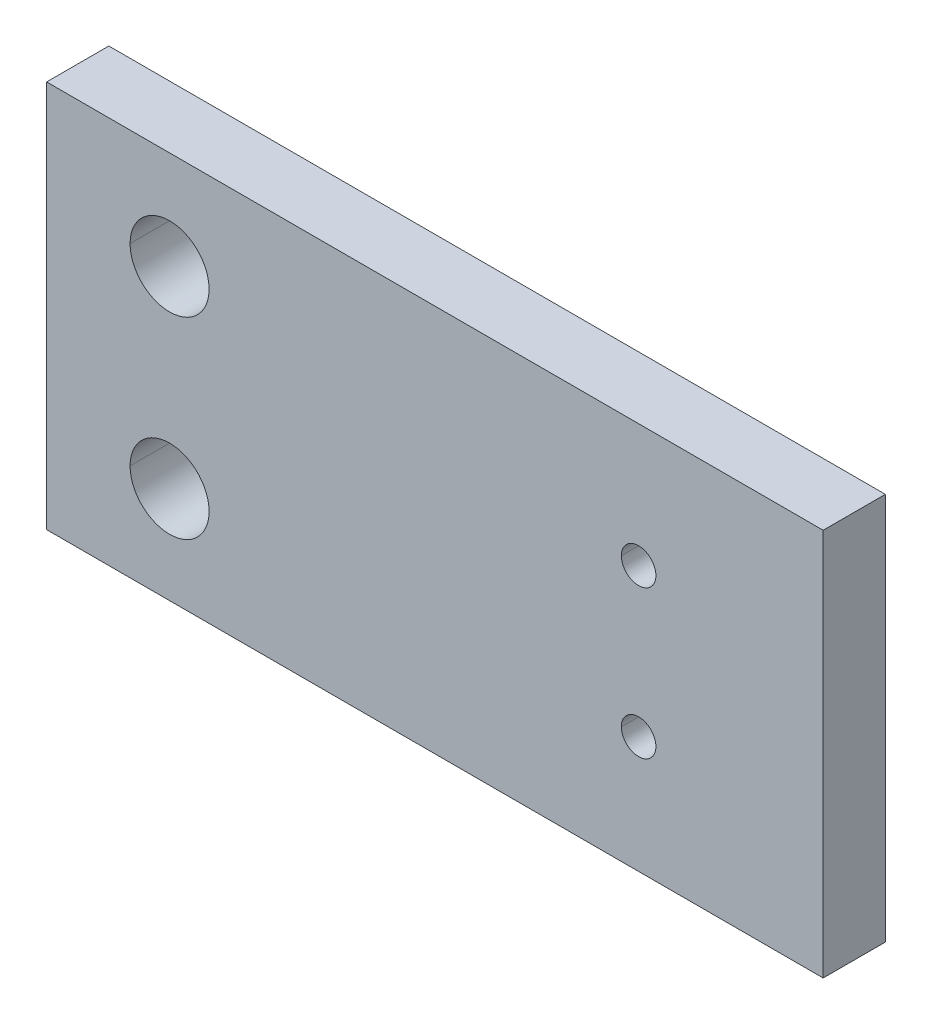
ISO-10303-21;
HEADER;
FILE_DESCRIPTION(('STEP AP214'),'2;1');
FILE_NAME('part.step','',(''),(''),'','','');
FILE_SCHEMA(('AUTOMOTIVE_DESIGN { 1 0 10303 214 1 1 1 1 }'));
ENDSEC;
DATA;
#1=APPLICATION_CONTEXT('core data for automotive mechanical design processes');
#2=APPLICATION_PROTOCOL_DEFINITION('international standard','automotive_design',2000,#1);
#3=PRODUCT_CONTEXT('',#1,'mechanical');
#4=PRODUCT('Part','Part','',(#3));
#5=PRODUCT_RELATED_PRODUCT_CATEGORY('part','',(#4));
#6=PRODUCT_DEFINITION_FORMATION('','',#4);
#7=PRODUCT_DEFINITION_CONTEXT('part definition',#1,'design');
#8=PRODUCT_DEFINITION('design','',#6,#7);
#9=PRODUCT_DEFINITION_SHAPE('','',#8);
#10=(LENGTH_UNIT() NAMED_UNIT(*) SI_UNIT(.MILLI.,.METRE.));
#11=(NAMED_UNIT(*) PLANE_ANGLE_UNIT() SI_UNIT($,.RADIAN.));
#12=(NAMED_UNIT(*) SI_UNIT($,.STERADIAN.) SOLID_ANGLE_UNIT());
#13=UNCERTAINTY_MEASURE_WITH_UNIT(LENGTH_MEASURE(1.E-05),#10,'distance_accuracy_value','');
#14=(GEOMETRIC_REPRESENTATION_CONTEXT(3) GLOBAL_UNCERTAINTY_ASSIGNED_CONTEXT((#13)) GLOBAL_UNIT_ASSIGNED_CONTEXT((#10,
#11,#12)) REPRESENTATION_CONTEXT('',''));
#15=CARTESIAN_POINT('',(0.,0.,0.));
#16=DIRECTION('',(0.,0.,1.));
#17=DIRECTION('',(1.,0.,0.));
#18=AXIS2_PLACEMENT_3D('',#15,#16,#17);
#19=CARTESIAN_POINT('',(10.,-5.,1.600028244856));
#20=DIRECTION('',(0.,0.,-1.));
#21=DIRECTION('',(0.,-1.,0.));
#22=AXIS2_PLACEMENT_3D('',#19,#20,#21);
#23=PLANE('',#22);
#24=CARTESIAN_POINT('',(15.240030480061,-3.175006350013,1.600028244856));
#25=DIRECTION('',(0.,0.,1.));
#26=DIRECTION('',(-1.,0.,0.));
#27=AXIS2_PLACEMENT_3D('',#24,#25,#26);
#28=CIRCLE('',#27,0.444500889002);
#29=CARTESIAN_POINT('',(14.795529591059,-3.175006350013,1.600028244856));
#30=VERTEX_POINT('',#29);
#31=CARTESIAN_POINT('',(15.684531369063,-3.175006350013,1.600028244856));
#32=VERTEX_POINT('',#31);
#33=EDGE_CURVE('E26',#30,#32,#28,.T.);
#34=ORIENTED_EDGE('',*,*,#33,.F.);
#35=CARTESIAN_POINT('',(15.240030480061,-3.175006350013,1.600028244856));
#36=DIRECTION('',(0.,0.,1.));
#37=DIRECTION('',(1.,0.,0.));
#38=AXIS2_PLACEMENT_3D('',#35,#36,#37);
#39=CIRCLE('',#38,0.444500889002);
#40=EDGE_CURVE('E256',#32,#30,#39,.T.);
#41=ORIENTED_EDGE('',*,*,#40,.F.);
#42=EDGE_LOOP('',(#34,#41));
#43=FACE_BOUND('',#42,.T.);
#44=CARTESIAN_POINT('',(15.240030480061,-6.985013970028,1.600028244856));
#45=DIRECTION('',(0.,0.,1.));
#46=DIRECTION('',(-1.,0.,0.));
#47=AXIS2_PLACEMENT_3D('',#44,#45,#46);
#48=CIRCLE('',#47,0.444500889002);
#49=CARTESIAN_POINT('',(14.795529591059,-6.985013970028,1.600028244856));
#50=VERTEX_POINT('',#49);
#51=CARTESIAN_POINT('',(15.684531369063,-6.985013970028,1.600028244856));
#52=VERTEX_POINT('',#51);
#53=EDGE_CURVE('E246',#50,#52,#48,.T.);
#54=ORIENTED_EDGE('',*,*,#53,.F.);
#55=CARTESIAN_POINT('',(15.240030480061,-6.985013970028,1.600028244856));
#56=DIRECTION('',(0.,0.,1.));
#57=DIRECTION('',(1.,0.,0.));
#58=AXIS2_PLACEMENT_3D('',#55,#56,#57);
#59=CIRCLE('',#58,0.444500889002);
#60=EDGE_CURVE('E234',#52,#50,#59,.T.);
#61=ORIENTED_EDGE('',*,*,#60,.F.);
#62=EDGE_LOOP('',(#54,#61));
#63=FACE_BOUND('',#62,.T.);
#64=CARTESIAN_POINT('',(3.175006350013,-2.54000508001,1.600028244856));
#65=DIRECTION('',(0.,0.,1.));
#66=DIRECTION('',(-1.,0.,0.));
#67=AXIS2_PLACEMENT_3D('',#64,#65,#66);
#68=CIRCLE('',#67,1.016002032004);
#69=CARTESIAN_POINT('',(2.159004318009,-2.54000508001,1.600028244856));
#70=VERTEX_POINT('',#69);
#71=CARTESIAN_POINT('',(4.191008382017,-2.54000508001,1.600028244856));
#72=VERTEX_POINT('',#71);
#73=EDGE_CURVE('E225',#70,#72,#68,.T.);
#74=ORIENTED_EDGE('',*,*,#73,.F.);
#75=CARTESIAN_POINT('',(3.175006350013,-2.54000508001,1.600028244856));
#76=DIRECTION('',(0.,0.,1.));
#77=DIRECTION('',(1.,0.,0.));
#78=AXIS2_PLACEMENT_3D('',#75,#76,#77);
#79=CIRCLE('',#78,1.016002032004);
#80=EDGE_CURVE('E212',#72,#70,#79,.T.);
#81=ORIENTED_EDGE('',*,*,#80,.F.);
#82=EDGE_LOOP('',(#74,#81));
#83=FACE_BOUND('',#82,.T.);
#84=CARTESIAN_POINT('',(3.175006350013,-7.49301498603,1.600028244856));
#85=DIRECTION('',(0.,0.,1.));
#86=DIRECTION('',(-1.,0.,0.));
#87=AXIS2_PLACEMENT_3D('',#84,#85,#86);
#88=CIRCLE('',#87,1.016002032004);
#89=CARTESIAN_POINT('',(2.159004318009,-7.49301498603,1.600028244856));
#90=VERTEX_POINT('',#89);
#91=CARTESIAN_POINT('',(4.191008382017,-7.49301498603,1.600028244856));
#92=VERTEX_POINT('',#91);
#93=EDGE_CURVE('E202',#90,#92,#88,.T.);
#94=ORIENTED_EDGE('',*,*,#93,.F.);
#95=CARTESIAN_POINT('',(3.175006350013,-7.49301498603,1.600028244856));
#96=DIRECTION('',(0.,0.,1.));
#97=DIRECTION('',(1.,0.,0.));
#98=AXIS2_PLACEMENT_3D('',#95,#96,#97);
#99=CIRCLE('',#98,1.016002032004);
#100=EDGE_CURVE('E178',#92,#90,#99,.T.);
#101=ORIENTED_EDGE('',*,*,#100,.F.);
#102=EDGE_LOOP('',(#94,#101));
#103=FACE_BOUND('',#102,.T.);
#104=DIRECTION('',(1.,0.,0.));
#105=VECTOR('',#104,1.);
#106=CARTESIAN_POINT('',(0.01270002540005,-0.01270002540005,1.600028244856));
#107=LINE('',#106,#105);
#108=CARTESIAN_POINT('',(0.01270002540005,-0.01270002540005,1.600028244856));
#109=VERTEX_POINT('',#108);
#110=CARTESIAN_POINT('',(19.9872999746,-0.01270002540005,1.600028244856));
#111=VERTEX_POINT('',#110);
#112=EDGE_CURVE('E170',#109,#111,#107,.T.);
#113=ORIENTED_EDGE('',*,*,#112,.F.);
#114=DIRECTION('',(0.,1.,0.));
#115=VECTOR('',#114,1.);
#116=CARTESIAN_POINT('',(0.01270002540005,-9.9872999746,1.600028244856));
#117=LINE('',#116,#115);
#118=CARTESIAN_POINT('',(0.01270002540005,-9.9872999746,1.600028244856));
#119=VERTEX_POINT('',#118);
#120=EDGE_CURVE('E147',#119,#109,#117,.T.);
#121=ORIENTED_EDGE('',*,*,#120,.F.);
#122=DIRECTION('',(-1.,0.,0.));
#123=VECTOR('',#122,1.);
#124=CARTESIAN_POINT('',(19.9872999746,-9.9872999746,1.600028244856));
#125=LINE('',#124,#123);
#126=CARTESIAN_POINT('',(19.9872999746,-9.9872999746,1.600028244856));
#127=VERTEX_POINT('',#126);
#128=EDGE_CURVE('E157',#127,#119,#125,.T.);
#129=ORIENTED_EDGE('',*,*,#128,.F.);
#130=DIRECTION('',(0.,-1.,0.));
#131=VECTOR('',#130,1.);
#132=CARTESIAN_POINT('',(19.9872999746,-0.01270002540005,1.600028244856));
#133=LINE('',#132,#131);
#134=EDGE_CURVE('E161',#111,#127,#133,.T.);
#135=ORIENTED_EDGE('',*,*,#134,.F.);
#136=EDGE_LOOP('',(#113,#121,#129,#135));
#137=FACE_BOUND('',#136,.T.);
#138=ADVANCED_FACE('F17',(#43,#63,#83,#103,#137),#23,.F.);
#139=CARTESIAN_POINT('',(10.,-5.,0.));
#140=DIRECTION('',(0.,0.,-1.));
#141=DIRECTION('',(0.,-1.,0.));
#142=AXIS2_PLACEMENT_3D('',#139,#140,#141);
#143=PLANE('',#142);
#144=CARTESIAN_POINT('',(15.240030480061,-3.175006350013,0.));
#145=DIRECTION('',(0.,0.,1.));
#146=DIRECTION('',(1.,0.,0.));
#147=AXIS2_PLACEMENT_3D('',#144,#145,#146);
#148=CIRCLE('',#147,0.444500889002);
#149=CARTESIAN_POINT('',(15.684531369063,-3.175006350013,0.));
#150=VERTEX_POINT('',#149);
#151=CARTESIAN_POINT('',(14.795529591059,-3.175006350013,0.));
#152=VERTEX_POINT('',#151);
#153=EDGE_CURVE('E263',#150,#152,#148,.T.);
#154=ORIENTED_EDGE('',*,*,#153,.T.);
#155=CARTESIAN_POINT('',(15.240030480061,-3.175006350013,0.));
#156=DIRECTION('',(0.,0.,1.));
#157=DIRECTION('',(-1.,0.,0.));
#158=AXIS2_PLACEMENT_3D('',#155,#156,#157);
#159=CIRCLE('',#158,0.444500889002);
#160=EDGE_CURVE('E11',#152,#150,#159,.T.);
#161=ORIENTED_EDGE('',*,*,#160,.T.);
#162=EDGE_LOOP('',(#154,#161));
#163=FACE_BOUND('',#162,.T.);
#164=CARTESIAN_POINT('',(15.240030480061,-6.985013970028,0.));
#165=DIRECTION('',(0.,0.,1.));
#166=DIRECTION('',(1.,0.,0.));
#167=AXIS2_PLACEMENT_3D('',#164,#165,#166);
#168=CIRCLE('',#167,0.444500889002);
#169=CARTESIAN_POINT('',(15.684531369063,-6.985013970028,0.));
#170=VERTEX_POINT('',#169);
#171=CARTESIAN_POINT('',(14.795529591059,-6.985013970028,0.));
#172=VERTEX_POINT('',#171);
#173=EDGE_CURVE('E242',#170,#172,#168,.T.);
#174=ORIENTED_EDGE('',*,*,#173,.T.);
#175=CARTESIAN_POINT('',(15.240030480061,-6.985013970028,0.));
#176=DIRECTION('',(0.,0.,1.));
#177=DIRECTION('',(-1.,0.,0.));
#178=AXIS2_PLACEMENT_3D('',#175,#176,#177);
#179=CIRCLE('',#178,0.444500889002);
#180=EDGE_CURVE('E249',#172,#170,#179,.T.);
#181=ORIENTED_EDGE('',*,*,#180,.T.);
#182=EDGE_LOOP('',(#174,#181));
#183=FACE_BOUND('',#182,.T.);
#184=CARTESIAN_POINT('',(3.175006350013,-2.54000508001,0.));
#185=DIRECTION('',(0.,0.,1.));
#186=DIRECTION('',(1.,0.,0.));
#187=AXIS2_PLACEMENT_3D('',#184,#185,#186);
#188=CIRCLE('',#187,1.016002032004);
#189=CARTESIAN_POINT('',(4.191008382017,-2.54000508001,0.));
#190=VERTEX_POINT('',#189);
#191=CARTESIAN_POINT('',(2.159004318009,-2.54000508001,0.));
#192=VERTEX_POINT('',#191);
#193=EDGE_CURVE('E220',#190,#192,#188,.T.);
#194=ORIENTED_EDGE('',*,*,#193,.T.);
#195=CARTESIAN_POINT('',(3.175006350013,-2.54000508001,0.));
#196=DIRECTION('',(0.,0.,1.));
#197=DIRECTION('',(-1.,0.,0.));
#198=AXIS2_PLACEMENT_3D('',#195,#196,#197);
#199=CIRCLE('',#198,1.016002032004);
#200=EDGE_CURVE('E221',#192,#190,#199,.T.);
#201=ORIENTED_EDGE('',*,*,#200,.T.);
#202=EDGE_LOOP('',(#194,#201));
#203=FACE_BOUND('',#202,.T.);
#204=CARTESIAN_POINT('',(3.175006350013,-7.49301498603,0.));
#205=DIRECTION('',(0.,0.,1.));
#206=DIRECTION('',(1.,0.,0.));
#207=AXIS2_PLACEMENT_3D('',#204,#205,#206);
#208=CIRCLE('',#207,1.016002032004);
#209=CARTESIAN_POINT('',(4.191008382017,-7.49301498603,0.));
#210=VERTEX_POINT('',#209);
#211=CARTESIAN_POINT('',(2.159004318009,-7.49301498603,0.));
#212=VERTEX_POINT('',#211);
#213=EDGE_CURVE('E198',#210,#212,#208,.T.);
#214=ORIENTED_EDGE('',*,*,#213,.T.);
#215=CARTESIAN_POINT('',(3.175006350013,-7.49301498603,0.));
#216=DIRECTION('',(0.,0.,1.));
#217=DIRECTION('',(-1.,0.,0.));
#218=AXIS2_PLACEMENT_3D('',#215,#216,#217);
#219=CIRCLE('',#218,1.016002032004);
#220=EDGE_CURVE('E205',#212,#210,#219,.T.);
#221=ORIENTED_EDGE('',*,*,#220,.T.);
#222=EDGE_LOOP('',(#214,#221));
#223=FACE_BOUND('',#222,.T.);
#224=DIRECTION('',(0.,-1.,0.));
#225=VECTOR('',#224,1.);
#226=CARTESIAN_POINT('',(19.9872999746,-0.01270002540005,0.));
#227=LINE('',#226,#225);
#228=CARTESIAN_POINT('',(19.9872999746,-0.01270002540005,0.));
#229=VERTEX_POINT('',#228);
#230=CARTESIAN_POINT('',(19.9872999746,-9.9872999746,0.));
#231=VERTEX_POINT('',#230);
#232=EDGE_CURVE('E150',#229,#231,#227,.T.);
#233=ORIENTED_EDGE('',*,*,#232,.T.);
#234=DIRECTION('',(-1.,0.,0.));
#235=VECTOR('',#234,1.);
#236=CARTESIAN_POINT('',(19.9872999746,-9.9872999746,0.));
#237=LINE('',#236,#235);
#238=CARTESIAN_POINT('',(0.01270002540005,-9.9872999746,0.));
#239=VERTEX_POINT('',#238);
#240=EDGE_CURVE('E135',#231,#239,#237,.T.);
#241=ORIENTED_EDGE('',*,*,#240,.T.);
#242=DIRECTION('',(0.,1.,0.));
#243=VECTOR('',#242,1.);
#244=CARTESIAN_POINT('',(0.01270002540005,-9.9872999746,0.));
#245=LINE('',#244,#243);
#246=CARTESIAN_POINT('',(0.01270002540005,-0.01270002540005,0.));
#247=VERTEX_POINT('',#246);
#248=EDGE_CURVE('E192',#239,#247,#245,.T.);
#249=ORIENTED_EDGE('',*,*,#248,.T.);
#250=DIRECTION('',(1.,0.,0.));
#251=VECTOR('',#250,1.);
#252=CARTESIAN_POINT('',(0.01270002540005,-0.01270002540005,0.));
#253=LINE('',#252,#251);
#254=EDGE_CURVE('E152',#247,#229,#253,.T.);
#255=ORIENTED_EDGE('',*,*,#254,.T.);
#256=EDGE_LOOP('',(#233,#241,#249,#255));
#257=FACE_BOUND('',#256,.T.);
#258=ADVANCED_FACE('F151',(#163,#183,#203,#223,#257),#143,.T.);
#259=CARTESIAN_POINT('',(15.240030480061,-3.175006350013,0.));
#260=DIRECTION('',(0.,0.,-1.));
#261=DIRECTION('',(-1.,0.,0.));
#262=AXIS2_PLACEMENT_3D('',#259,#260,#261);
#263=CYLINDRICAL_SURFACE('',#262,0.444500889002);
#264=DIRECTION('',(0.,0.,1.));
#265=VECTOR('',#264,1.);
#266=CARTESIAN_POINT('',(14.795529591059,-3.175006350013,0.));
#267=LINE('',#266,#265);
#268=EDGE_CURVE('E260',#152,#30,#267,.T.);
#269=ORIENTED_EDGE('',*,*,#268,.T.);
#270=ORIENTED_EDGE('',*,*,#33,.T.);
#271=DIRECTION('',(0.,0.,1.));
#272=VECTOR('',#271,1.);
#273=CARTESIAN_POINT('',(15.684531369063,-3.175006350013,0.));
#274=LINE('',#273,#272);
#275=EDGE_CURVE('E252',#150,#32,#274,.T.);
#276=ORIENTED_EDGE('',*,*,#275,.F.);
#277=ORIENTED_EDGE('',*,*,#160,.F.);
#278=EDGE_LOOP('',(#269,#270,#276,#277));
#279=FACE_BOUND('',#278,.T.);
#280=ADVANCED_FACE('F19',(#279),#263,.F.);
#281=CARTESIAN_POINT('',(15.240030480061,-3.175006350013,0.));
#282=DIRECTION('',(0.,0.,-1.));
#283=DIRECTION('',(1.,0.,0.));
#284=AXIS2_PLACEMENT_3D('',#281,#282,#283);
#285=CYLINDRICAL_SURFACE('',#284,0.444500889002);
#286=ORIENTED_EDGE('',*,*,#275,.T.);
#287=ORIENTED_EDGE('',*,*,#40,.T.);
#288=ORIENTED_EDGE('',*,*,#268,.F.);
#289=ORIENTED_EDGE('',*,*,#153,.F.);
#290=EDGE_LOOP('',(#286,#287,#288,#289));
#291=FACE_BOUND('',#290,.T.);
#292=ADVANCED_FACE('F271',(#291),#285,.F.);
#293=CARTESIAN_POINT('',(15.240030480061,-6.985013970028,0.));
#294=DIRECTION('',(0.,0.,-1.));
#295=DIRECTION('',(-1.,0.,0.));
#296=AXIS2_PLACEMENT_3D('',#293,#294,#295);
#297=CYLINDRICAL_SURFACE('',#296,0.444500889002);
#298=DIRECTION('',(0.,0.,1.));
#299=VECTOR('',#298,1.);
#300=CARTESIAN_POINT('',(14.795529591059,-6.985013970028,0.));
#301=LINE('',#300,#299);
#302=EDGE_CURVE('E238',#172,#50,#301,.T.);
#303=ORIENTED_EDGE('',*,*,#302,.T.);
#304=ORIENTED_EDGE('',*,*,#53,.T.);
#305=DIRECTION('',(0.,0.,1.));
#306=VECTOR('',#305,1.);
#307=CARTESIAN_POINT('',(15.684531369063,-6.985013970028,0.));
#308=LINE('',#307,#306);
#309=EDGE_CURVE('E224',#170,#52,#308,.T.);
#310=ORIENTED_EDGE('',*,*,#309,.F.);
#311=ORIENTED_EDGE('',*,*,#180,.F.);
#312=EDGE_LOOP('',(#303,#304,#310,#311));
#313=FACE_BOUND('',#312,.T.);
#314=ADVANCED_FACE('F335',(#313),#297,.F.);
#315=CARTESIAN_POINT('',(15.240030480061,-6.985013970028,0.));
#316=DIRECTION('',(0.,0.,-1.));
#317=DIRECTION('',(1.,0.,0.));
#318=AXIS2_PLACEMENT_3D('',#315,#316,#317);
#319=CYLINDRICAL_SURFACE('',#318,0.444500889002);
#320=ORIENTED_EDGE('',*,*,#309,.T.);
#321=ORIENTED_EDGE('',*,*,#60,.T.);
#322=ORIENTED_EDGE('',*,*,#302,.F.);
#323=ORIENTED_EDGE('',*,*,#173,.F.);
#324=EDGE_LOOP('',(#320,#321,#322,#323));
#325=FACE_BOUND('',#324,.T.);
#326=ADVANCED_FACE('F332',(#325),#319,.F.);
#327=CARTESIAN_POINT('',(3.175006350013,-2.54000508001,0.));
#328=DIRECTION('',(0.,0.,-1.));
#329=DIRECTION('',(-1.,0.,0.));
#330=AXIS2_PLACEMENT_3D('',#327,#328,#329);
#331=CYLINDRICAL_SURFACE('',#330,1.016002032004);
#332=DIRECTION('',(0.,0.,1.));
#333=VECTOR('',#332,1.);
#334=CARTESIAN_POINT('',(2.159004318009,-2.54000508001,0.));
#335=LINE('',#334,#333);
#336=EDGE_CURVE('E216',#192,#70,#335,.T.);
#337=ORIENTED_EDGE('',*,*,#336,.T.);
#338=ORIENTED_EDGE('',*,*,#73,.T.);
#339=DIRECTION('',(0.,0.,1.));
#340=VECTOR('',#339,1.);
#341=CARTESIAN_POINT('',(4.191008382017,-2.54000508001,0.));
#342=LINE('',#341,#340);
#343=EDGE_CURVE('E208',#190,#72,#342,.T.);
#344=ORIENTED_EDGE('',*,*,#343,.F.);
#345=ORIENTED_EDGE('',*,*,#200,.F.);
#346=EDGE_LOOP('',(#337,#338,#344,#345));
#347=FACE_BOUND('',#346,.T.);
#348=ADVANCED_FACE('F328',(#347),#331,.F.);
#349=CARTESIAN_POINT('',(3.175006350013,-2.54000508001,0.));
#350=DIRECTION('',(0.,0.,-1.));
#351=DIRECTION('',(1.,0.,0.));
#352=AXIS2_PLACEMENT_3D('',#349,#350,#351);
#353=CYLINDRICAL_SURFACE('',#352,1.016002032004);
#354=ORIENTED_EDGE('',*,*,#343,.T.);
#355=ORIENTED_EDGE('',*,*,#80,.T.);
#356=ORIENTED_EDGE('',*,*,#336,.F.);
#357=ORIENTED_EDGE('',*,*,#193,.F.);
#358=EDGE_LOOP('',(#354,#355,#356,#357));
#359=FACE_BOUND('',#358,.T.);
#360=ADVANCED_FACE('F322',(#359),#353,.F.);
#361=CARTESIAN_POINT('',(3.175006350013,-7.49301498603,0.));
#362=DIRECTION('',(0.,0.,-1.));
#363=DIRECTION('',(-1.,0.,0.));
#364=AXIS2_PLACEMENT_3D('',#361,#362,#363);
#365=CYLINDRICAL_SURFACE('',#364,1.016002032004);
#366=DIRECTION('',(0.,0.,1.));
#367=VECTOR('',#366,1.);
#368=CARTESIAN_POINT('',(2.159004318009,-7.49301498603,0.));
#369=LINE('',#368,#367);
#370=EDGE_CURVE('E184',#212,#90,#369,.T.);
#371=ORIENTED_EDGE('',*,*,#370,.T.);
#372=ORIENTED_EDGE('',*,*,#93,.T.);
#373=DIRECTION('',(0.,0.,1.));
#374=VECTOR('',#373,1.);
#375=CARTESIAN_POINT('',(4.191008382017,-7.49301498603,0.));
#376=LINE('',#375,#374);
#377=EDGE_CURVE('E174',#210,#92,#376,.T.);
#378=ORIENTED_EDGE('',*,*,#377,.F.);
#379=ORIENTED_EDGE('',*,*,#220,.F.);
#380=EDGE_LOOP('',(#371,#372,#378,#379));
#381=FACE_BOUND('',#380,.T.);
#382=ADVANCED_FACE('F289',(#381),#365,.F.);
#383=CARTESIAN_POINT('',(3.175006350013,-7.49301498603,0.));
#384=DIRECTION('',(0.,0.,-1.));
#385=DIRECTION('',(1.,0.,0.));
#386=AXIS2_PLACEMENT_3D('',#383,#384,#385);
#387=CYLINDRICAL_SURFACE('',#386,1.016002032004);
#388=ORIENTED_EDGE('',*,*,#377,.T.);
#389=ORIENTED_EDGE('',*,*,#100,.T.);
#390=ORIENTED_EDGE('',*,*,#370,.F.);
#391=ORIENTED_EDGE('',*,*,#213,.F.);
#392=EDGE_LOOP('',(#388,#389,#390,#391));
#393=FACE_BOUND('',#392,.T.);
#394=ADVANCED_FACE('F286',(#393),#387,.F.);
#395=CARTESIAN_POINT('',(0.01270002540005,-0.01270002540005,0.));
#396=DIRECTION('',(0.,1.,0.));
#397=DIRECTION('',(1.,0.,0.));
#398=AXIS2_PLACEMENT_3D('',#395,#396,#397);
#399=PLANE('',#398);
#400=DIRECTION('',(0.,0.,1.));
#401=VECTOR('',#400,1.);
#402=CARTESIAN_POINT('',(0.01270002540005,-0.01270002540005,0.));
#403=LINE('',#402,#401);
#404=EDGE_CURVE('E188',#247,#109,#403,.T.);
#405=ORIENTED_EDGE('',*,*,#404,.T.);
#406=ORIENTED_EDGE('',*,*,#112,.T.);
#407=DIRECTION('',(0.,0.,1.));
#408=VECTOR('',#407,1.);
#409=CARTESIAN_POINT('',(19.9872999746,-0.01270002540005,0.));
#410=LINE('',#409,#408);
#411=EDGE_CURVE('E167',#229,#111,#410,.T.);
#412=ORIENTED_EDGE('',*,*,#411,.F.);
#413=ORIENTED_EDGE('',*,*,#254,.F.);
#414=EDGE_LOOP('',(#405,#406,#412,#413));
#415=FACE_BOUND('',#414,.T.);
#416=ADVANCED_FACE('F295',(#415),#399,.T.);
#417=CARTESIAN_POINT('',(0.01270002540005,-9.9872999746,0.));
#418=DIRECTION('',(-1.,0.,0.));
#419=DIRECTION('',(0.,0.,1.));
#420=AXIS2_PLACEMENT_3D('',#417,#418,#419);
#421=PLANE('',#420);
#422=DIRECTION('',(0.,0.,1.));
#423=VECTOR('',#422,1.);
#424=CARTESIAN_POINT('',(0.01270002540005,-9.9872999746,0.));
#425=LINE('',#424,#423);
#426=EDGE_CURVE('E143',#239,#119,#425,.T.);
#427=ORIENTED_EDGE('',*,*,#426,.T.);
#428=ORIENTED_EDGE('',*,*,#120,.T.);
#429=ORIENTED_EDGE('',*,*,#404,.F.);
#430=ORIENTED_EDGE('',*,*,#248,.F.);
#431=EDGE_LOOP('',(#427,#428,#429,#430));
#432=FACE_BOUND('',#431,.T.);
#433=ADVANCED_FACE('F297',(#432),#421,.T.);
#434=CARTESIAN_POINT('',(19.9872999746,-9.9872999746,0.));
#435=DIRECTION('',(0.,-1.,0.));
#436=DIRECTION('',(0.,0.,-1.));
#437=AXIS2_PLACEMENT_3D('',#434,#435,#436);
#438=PLANE('',#437);
#439=DIRECTION('',(0.,0.,1.));
#440=VECTOR('',#439,1.);
#441=CARTESIAN_POINT('',(19.9872999746,-9.9872999746,0.));
#442=LINE('',#441,#440);
#443=EDGE_CURVE('E140',#231,#127,#442,.T.);
#444=ORIENTED_EDGE('',*,*,#443,.T.);
#445=ORIENTED_EDGE('',*,*,#128,.T.);
#446=ORIENTED_EDGE('',*,*,#426,.F.);
#447=ORIENTED_EDGE('',*,*,#240,.F.);
#448=EDGE_LOOP('',(#444,#445,#446,#447));
#449=FACE_BOUND('',#448,.T.);
#450=ADVANCED_FACE('F137',(#449),#438,.T.);
#451=CARTESIAN_POINT('',(19.9872999746,-0.01270002540005,0.));
#452=DIRECTION('',(1.,0.,0.));
#453=DIRECTION('',(0.,1.,0.));
#454=AXIS2_PLACEMENT_3D('',#451,#452,#453);
#455=PLANE('',#454);
#456=ORIENTED_EDGE('',*,*,#411,.T.);
#457=ORIENTED_EDGE('',*,*,#134,.T.);
#458=ORIENTED_EDGE('',*,*,#443,.F.);
#459=ORIENTED_EDGE('',*,*,#232,.F.);
#460=EDGE_LOOP('',(#456,#457,#458,#459));
#461=FACE_BOUND('',#460,.T.);
#462=ADVANCED_FACE('F159',(#461),#455,.T.);
#463=CLOSED_SHELL('',(#138,#258,#280,#292,#314,#326,#348,#360,#382,#394,#416,#433,#450,#462));
#464=MANIFOLD_SOLID_BREP('B1',#463);
#465=ADVANCED_BREP_SHAPE_REPRESENTATION('',(#18,#464),#14);
#466=SHAPE_DEFINITION_REPRESENTATION(#9,#465);
ENDSEC;
END-ISO-10303-21;
